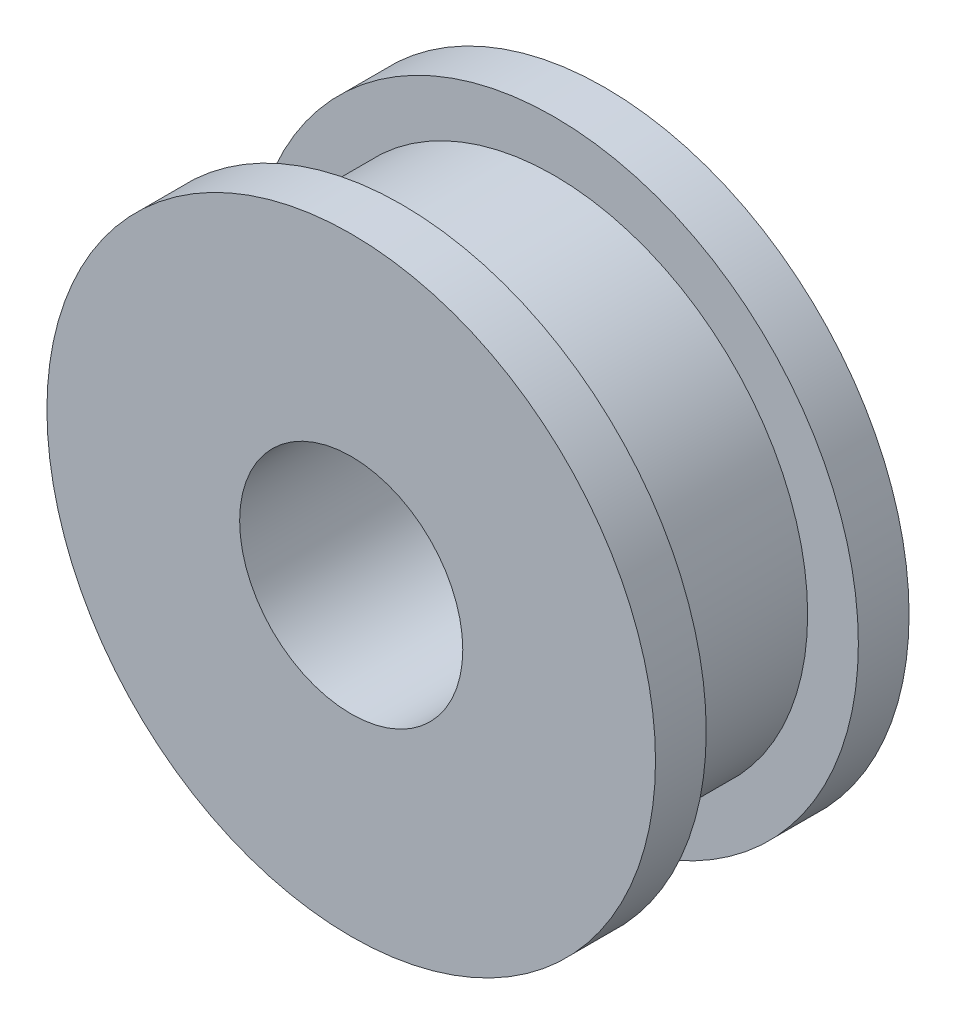
ISO-10303-21;
HEADER;
FILE_DESCRIPTION(('STEP AP214'),'2;1');
FILE_NAME('part.step','',(''),(''),'','','');
FILE_SCHEMA(('AUTOMOTIVE_DESIGN { 1 0 10303 214 1 1 1 1 }'));
ENDSEC;
DATA;
#1=APPLICATION_CONTEXT('core data for automotive mechanical design processes');
#2=APPLICATION_PROTOCOL_DEFINITION('international standard','automotive_design',2000,#1);
#3=PRODUCT_CONTEXT('',#1,'mechanical');
#4=PRODUCT('Part','Part','',(#3));
#5=PRODUCT_RELATED_PRODUCT_CATEGORY('part','',(#4));
#6=PRODUCT_DEFINITION_FORMATION('','',#4);
#7=PRODUCT_DEFINITION_CONTEXT('part definition',#1,'design');
#8=PRODUCT_DEFINITION('design','',#6,#7);
#9=PRODUCT_DEFINITION_SHAPE('','',#8);
#10=(LENGTH_UNIT() NAMED_UNIT(*) SI_UNIT(.MILLI.,.METRE.));
#11=(NAMED_UNIT(*) PLANE_ANGLE_UNIT() SI_UNIT($,.RADIAN.));
#12=(NAMED_UNIT(*) SI_UNIT($,.STERADIAN.) SOLID_ANGLE_UNIT());
#13=UNCERTAINTY_MEASURE_WITH_UNIT(LENGTH_MEASURE(1.E-05),#10,'distance_accuracy_value','');
#14=(GEOMETRIC_REPRESENTATION_CONTEXT(3) GLOBAL_UNCERTAINTY_ASSIGNED_CONTEXT((#13)) GLOBAL_UNIT_ASSIGNED_CONTEXT((#10,
#11,#12)) REPRESENTATION_CONTEXT('',''));
#15=CARTESIAN_POINT('',(0.,0.,0.));
#16=DIRECTION('',(0.,0.,1.));
#17=DIRECTION('',(1.,0.,0.));
#18=AXIS2_PLACEMENT_3D('',#15,#16,#17);
#19=CARTESIAN_POINT('',(0.,0.,15.));
#20=DIRECTION('',(0.,0.,-1.));
#21=DIRECTION('',(-1.,0.,0.));
#22=AXIS2_PLACEMENT_3D('',#19,#20,#21);
#23=CYLINDRICAL_SURFACE('',#22,25.);
#24=CARTESIAN_POINT('',(0.,0.,15.));
#25=DIRECTION('',(0.,0.,1.));
#26=DIRECTION('',(1.,0.,0.));
#27=AXIS2_PLACEMENT_3D('',#24,#25,#26);
#28=CIRCLE('',#27,25.);
#29=CARTESIAN_POINT('',(25.,0.,15.));
#30=VERTEX_POINT('',#29);
#31=EDGE_CURVE('E10',#30,#30,#28,.T.);
#32=ORIENTED_EDGE('',*,*,#31,.F.);
#33=EDGE_LOOP('',(#32));
#34=FACE_BOUND('',#33,.T.);
#35=CARTESIAN_POINT('',(0.,0.,0.));
#36=DIRECTION('',(0.,0.,1.));
#37=DIRECTION('',(1.,0.,0.));
#38=AXIS2_PLACEMENT_3D('',#35,#36,#37);
#39=CIRCLE('',#38,25.);
#40=CARTESIAN_POINT('',(25.,0.,0.));
#41=VERTEX_POINT('',#40);
#42=EDGE_CURVE('E34',#41,#41,#39,.T.);
#43=ORIENTED_EDGE('',*,*,#42,.T.);
#44=EDGE_LOOP('',(#43));
#45=FACE_BOUND('',#44,.T.);
#46=ADVANCED_FACE('F31',(#34,#45),#23,.T.);
#47=CARTESIAN_POINT('',(0.,0.,-5.));
#48=DIRECTION('',(0.,0.,1.));
#49=DIRECTION('',(1.,0.,0.));
#50=AXIS2_PLACEMENT_3D('',#47,#48,#49);
#51=CYLINDRICAL_SURFACE('',#50,30.);
#52=CARTESIAN_POINT('',(0.,0.,-5.));
#53=DIRECTION('',(0.,0.,-1.));
#54=DIRECTION('',(-1.,0.,0.));
#55=AXIS2_PLACEMENT_3D('',#52,#53,#54);
#56=CIRCLE('',#55,30.);
#57=CARTESIAN_POINT('',(-30.,0.,-5.));
#58=VERTEX_POINT('',#57);
#59=EDGE_CURVE('E41',#58,#58,#56,.T.);
#60=ORIENTED_EDGE('',*,*,#59,.F.);
#61=EDGE_LOOP('',(#60));
#62=FACE_BOUND('',#61,.T.);
#63=CARTESIAN_POINT('',(0.,0.,0.));
#64=DIRECTION('',(0.,0.,-1.));
#65=DIRECTION('',(-1.,0.,0.));
#66=AXIS2_PLACEMENT_3D('',#63,#64,#65);
#67=CIRCLE('',#66,30.);
#68=CARTESIAN_POINT('',(-30.,0.,0.));
#69=VERTEX_POINT('',#68);
#70=EDGE_CURVE('E43',#69,#69,#67,.T.);
#71=ORIENTED_EDGE('',*,*,#70,.T.);
#72=EDGE_LOOP('',(#71));
#73=FACE_BOUND('',#72,.T.);
#74=ADVANCED_FACE('F89',(#62,#73),#51,.T.);
#75=CARTESIAN_POINT('',(0.,0.,-5.));
#76=DIRECTION('',(0.,0.,-1.));
#77=DIRECTION('',(-1.,0.,0.));
#78=AXIS2_PLACEMENT_3D('',#75,#76,#77);
#79=PLANE('',#78);
#80=CARTESIAN_POINT('',(0.,0.,-5.));
#81=DIRECTION('',(0.,0.,1.));
#82=DIRECTION('',(1.,0.,0.));
#83=AXIS2_PLACEMENT_3D('',#80,#81,#82);
#84=CIRCLE('',#83,11.);
#85=CARTESIAN_POINT('',(11.,0.,-5.));
#86=VERTEX_POINT('',#85);
#87=EDGE_CURVE('E52',#86,#86,#84,.T.);
#88=ORIENTED_EDGE('',*,*,#87,.T.);
#89=EDGE_LOOP('',(#88));
#90=FACE_BOUND('',#89,.T.);
#91=ORIENTED_EDGE('',*,*,#59,.T.);
#92=EDGE_LOOP('',(#91));
#93=FACE_BOUND('',#92,.T.);
#94=ADVANCED_FACE('F61',(#90,#93),#79,.T.);
#95=CARTESIAN_POINT('',(0.,0.,0.));
#96=DIRECTION('',(0.,0.,-1.));
#97=DIRECTION('',(-1.,0.,0.));
#98=AXIS2_PLACEMENT_3D('',#95,#96,#97);
#99=PLANE('',#98);
#100=ORIENTED_EDGE('',*,*,#42,.F.);
#101=EDGE_LOOP('',(#100));
#102=FACE_BOUND('',#101,.T.);
#103=ORIENTED_EDGE('',*,*,#70,.F.);
#104=EDGE_LOOP('',(#103));
#105=FACE_BOUND('',#104,.T.);
#106=ADVANCED_FACE('F80',(#102,#105),#99,.F.);
#107=CARTESIAN_POINT('',(0.,0.,20.));
#108=DIRECTION('',(0.,0.,-1.));
#109=DIRECTION('',(-1.,0.,0.));
#110=AXIS2_PLACEMENT_3D('',#107,#108,#109);
#111=CYLINDRICAL_SURFACE('',#110,30.);
#112=CARTESIAN_POINT('',(0.,0.,20.));
#113=DIRECTION('',(0.,0.,1.));
#114=DIRECTION('',(1.,0.,0.));
#115=AXIS2_PLACEMENT_3D('',#112,#113,#114);
#116=CIRCLE('',#115,30.);
#117=CARTESIAN_POINT('',(30.,0.,20.));
#118=VERTEX_POINT('',#117);
#119=EDGE_CURVE('E46',#118,#118,#116,.T.);
#120=ORIENTED_EDGE('',*,*,#119,.F.);
#121=EDGE_LOOP('',(#120));
#122=FACE_BOUND('',#121,.T.);
#123=CARTESIAN_POINT('',(0.,0.,15.));
#124=DIRECTION('',(0.,0.,1.));
#125=DIRECTION('',(1.,0.,0.));
#126=AXIS2_PLACEMENT_3D('',#123,#124,#125);
#127=CIRCLE('',#126,30.);
#128=CARTESIAN_POINT('',(30.,0.,15.));
#129=VERTEX_POINT('',#128);
#130=EDGE_CURVE('E49',#129,#129,#127,.T.);
#131=ORIENTED_EDGE('',*,*,#130,.T.);
#132=EDGE_LOOP('',(#131));
#133=FACE_BOUND('',#132,.T.);
#134=ADVANCED_FACE('F74',(#122,#133),#111,.T.);
#135=CARTESIAN_POINT('',(0.,0.,20.));
#136=DIRECTION('',(0.,0.,1.));
#137=DIRECTION('',(1.,0.,0.));
#138=AXIS2_PLACEMENT_3D('',#135,#136,#137);
#139=PLANE('',#138);
#140=CARTESIAN_POINT('',(0.,0.,20.));
#141=DIRECTION('',(0.,0.,1.));
#142=DIRECTION('',(1.,0.,0.));
#143=AXIS2_PLACEMENT_3D('',#140,#141,#142);
#144=CIRCLE('',#143,11.);
#145=CARTESIAN_POINT('',(11.,0.,20.));
#146=VERTEX_POINT('',#145);
#147=EDGE_CURVE('E55',#146,#146,#144,.T.);
#148=ORIENTED_EDGE('',*,*,#147,.F.);
#149=EDGE_LOOP('',(#148));
#150=FACE_BOUND('',#149,.T.);
#151=ORIENTED_EDGE('',*,*,#119,.T.);
#152=EDGE_LOOP('',(#151));
#153=FACE_BOUND('',#152,.T.);
#154=ADVANCED_FACE('F71',(#150,#153),#139,.T.);
#155=CARTESIAN_POINT('',(0.,0.,15.));
#156=DIRECTION('',(0.,0.,1.));
#157=DIRECTION('',(1.,0.,0.));
#158=AXIS2_PLACEMENT_3D('',#155,#156,#157);
#159=PLANE('',#158);
#160=ORIENTED_EDGE('',*,*,#31,.T.);
#161=EDGE_LOOP('',(#160));
#162=FACE_BOUND('',#161,.T.);
#163=ORIENTED_EDGE('',*,*,#130,.F.);
#164=EDGE_LOOP('',(#163));
#165=FACE_BOUND('',#164,.T.);
#166=ADVANCED_FACE('F67',(#162,#165),#159,.F.);
#167=CARTESIAN_POINT('',(0.,0.,-5.));
#168=DIRECTION('',(0.,0.,1.));
#169=DIRECTION('',(1.,0.,0.));
#170=AXIS2_PLACEMENT_3D('',#167,#168,#169);
#171=CYLINDRICAL_SURFACE('',#170,11.);
#172=ORIENTED_EDGE('',*,*,#87,.F.);
#173=EDGE_LOOP('',(#172));
#174=FACE_BOUND('',#173,.T.);
#175=ORIENTED_EDGE('',*,*,#147,.T.);
#176=EDGE_LOOP('',(#175));
#177=FACE_BOUND('',#176,.T.);
#178=ADVANCED_FACE('F64',(#174,#177),#171,.F.);
#179=CLOSED_SHELL('',(#46,#74,#94,#106,#134,#154,#166,#178));
#180=MANIFOLD_SOLID_BREP('B2',#179);
#181=ADVANCED_BREP_SHAPE_REPRESENTATION('',(#18,#180),#14);
#182=SHAPE_DEFINITION_REPRESENTATION(#9,#181);
ENDSEC;
END-ISO-10303-21;
